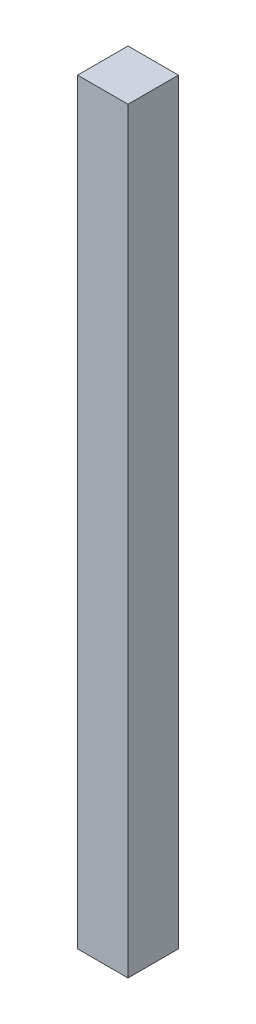
ISO-10303-21;
HEADER;
FILE_DESCRIPTION(('STEP AP214'),'2;1');
FILE_NAME('part.step','',(''),(''),'','','');
FILE_SCHEMA(('AUTOMOTIVE_DESIGN { 1 0 10303 214 1 1 1 1 }'));
ENDSEC;
DATA;
#1=APPLICATION_CONTEXT('core data for automotive mechanical design processes');
#2=APPLICATION_PROTOCOL_DEFINITION('international standard','automotive_design',2000,#1);
#3=PRODUCT_CONTEXT('',#1,'mechanical');
#4=PRODUCT('Part','Part','',(#3));
#5=PRODUCT_RELATED_PRODUCT_CATEGORY('part','',(#4));
#6=PRODUCT_DEFINITION_FORMATION('','',#4);
#7=PRODUCT_DEFINITION_CONTEXT('part definition',#1,'design');
#8=PRODUCT_DEFINITION('design','',#6,#7);
#9=PRODUCT_DEFINITION_SHAPE('','',#8);
#10=(LENGTH_UNIT() NAMED_UNIT(*) SI_UNIT(.MILLI.,.METRE.));
#11=(NAMED_UNIT(*) PLANE_ANGLE_UNIT() SI_UNIT($,.RADIAN.));
#12=(NAMED_UNIT(*) SI_UNIT($,.STERADIAN.) SOLID_ANGLE_UNIT());
#13=UNCERTAINTY_MEASURE_WITH_UNIT(LENGTH_MEASURE(1.E-05),#10,'distance_accuracy_value','');
#14=(GEOMETRIC_REPRESENTATION_CONTEXT(3) GLOBAL_UNCERTAINTY_ASSIGNED_CONTEXT((#13)) GLOBAL_UNIT_ASSIGNED_CONTEXT((#10,
#11,#12)) REPRESENTATION_CONTEXT('',''));
#15=CARTESIAN_POINT('',(0.,0.,0.));
#16=DIRECTION('',(0.,0.,1.));
#17=DIRECTION('',(1.,0.,0.));
#18=AXIS2_PLACEMENT_3D('',#15,#16,#17);
#19=CARTESIAN_POINT('',(0.5,15.,0.500000000000004));
#20=DIRECTION('',(-1.,0.,0.));
#21=DIRECTION('',(0.,0.,1.));
#22=AXIS2_PLACEMENT_3D('',#19,#20,#21);
#23=PLANE('',#22);
#24=DIRECTION('',(0.,0.,-1.));
#25=VECTOR('',#24,1.);
#26=CARTESIAN_POINT('',(0.5,0.,0.500000000000004));
#27=LINE('',#26,#25);
#28=CARTESIAN_POINT('',(0.5,0.,0.500000000000004));
#29=VERTEX_POINT('',#28);
#30=CARTESIAN_POINT('',(0.5,0.,-0.499999999999997));
#31=VERTEX_POINT('',#30);
#32=EDGE_CURVE('E107',#29,#31,#27,.T.);
#33=ORIENTED_EDGE('',*,*,#32,.T.);
#34=DIRECTION('',(0.,-1.,0.));
#35=VECTOR('',#34,1.);
#36=CARTESIAN_POINT('',(0.5,15.,-0.499999999999997));
#37=LINE('',#36,#35);
#38=CARTESIAN_POINT('',(0.5,15.,-0.499999999999997));
#39=VERTEX_POINT('',#38);
#40=EDGE_CURVE('E11',#39,#31,#37,.T.);
#41=ORIENTED_EDGE('',*,*,#40,.F.);
#42=DIRECTION('',(0.,0.,-1.));
#43=VECTOR('',#42,1.);
#44=CARTESIAN_POINT('',(0.5,15.,0.500000000000004));
#45=LINE('',#44,#43);
#46=CARTESIAN_POINT('',(0.5,15.,0.500000000000004));
#47=VERTEX_POINT('',#46);
#48=EDGE_CURVE('E91',#47,#39,#45,.T.);
#49=ORIENTED_EDGE('',*,*,#48,.F.);
#50=DIRECTION('',(0.,-1.,0.));
#51=VECTOR('',#50,1.);
#52=CARTESIAN_POINT('',(0.5,15.,0.500000000000004));
#53=LINE('',#52,#51);
#54=EDGE_CURVE('E103',#47,#29,#53,.T.);
#55=ORIENTED_EDGE('',*,*,#54,.T.);
#56=EDGE_LOOP('',(#33,#41,#49,#55));
#57=FACE_BOUND('',#56,.T.);
#58=ADVANCED_FACE('F39',(#57),#23,.F.);
#59=CARTESIAN_POINT('',(-0.5,15.,-0.499999999999997));
#60=DIRECTION('',(0.,0.,1.));
#61=DIRECTION('',(1.,0.,0.));
#62=AXIS2_PLACEMENT_3D('',#59,#60,#61);
#63=PLANE('',#62);
#64=DIRECTION('',(-1.,0.,0.));
#65=VECTOR('',#64,1.);
#66=CARTESIAN_POINT('',(-0.5,0.,-0.499999999999997));
#67=LINE('',#66,#65);
#68=CARTESIAN_POINT('',(-0.5,0.,-0.499999999999997));
#69=VERTEX_POINT('',#68);
#70=EDGE_CURVE('E96',#31,#69,#67,.T.);
#71=ORIENTED_EDGE('',*,*,#70,.T.);
#72=DIRECTION('',(0.,-1.,0.));
#73=VECTOR('',#72,1.);
#74=CARTESIAN_POINT('',(-0.5,15.,-0.499999999999997));
#75=LINE('',#74,#73);
#76=CARTESIAN_POINT('',(-0.5,15.,-0.499999999999997));
#77=VERTEX_POINT('',#76);
#78=EDGE_CURVE('E48',#77,#69,#75,.T.);
#79=ORIENTED_EDGE('',*,*,#78,.F.);
#80=DIRECTION('',(-1.,0.,0.));
#81=VECTOR('',#80,1.);
#82=CARTESIAN_POINT('',(-0.5,15.,-0.499999999999997));
#83=LINE('',#82,#81);
#84=EDGE_CURVE('E86',#39,#77,#83,.T.);
#85=ORIENTED_EDGE('',*,*,#84,.F.);
#86=ORIENTED_EDGE('',*,*,#40,.T.);
#87=EDGE_LOOP('',(#71,#79,#85,#86));
#88=FACE_BOUND('',#87,.T.);
#89=ADVANCED_FACE('F95',(#88),#63,.F.);
#90=CARTESIAN_POINT('',(-0.5,15.,0.500000000000004));
#91=DIRECTION('',(1.,0.,0.));
#92=DIRECTION('',(0.,0.,-1.));
#93=AXIS2_PLACEMENT_3D('',#90,#91,#92);
#94=PLANE('',#93);
#95=DIRECTION('',(0.,0.,1.));
#96=VECTOR('',#95,1.);
#97=CARTESIAN_POINT('',(-0.5,0.,0.500000000000004));
#98=LINE('',#97,#96);
#99=CARTESIAN_POINT('',(-0.5,0.,0.500000000000004));
#100=VERTEX_POINT('',#99);
#101=EDGE_CURVE('E73',#69,#100,#98,.T.);
#102=ORIENTED_EDGE('',*,*,#101,.T.);
#103=DIRECTION('',(0.,-1.,0.));
#104=VECTOR('',#103,1.);
#105=CARTESIAN_POINT('',(-0.5,15.,0.500000000000004));
#106=LINE('',#105,#104);
#107=CARTESIAN_POINT('',(-0.5,15.,0.500000000000004));
#108=VERTEX_POINT('',#107);
#109=EDGE_CURVE('E98',#108,#100,#106,.T.);
#110=ORIENTED_EDGE('',*,*,#109,.F.);
#111=DIRECTION('',(0.,0.,1.));
#112=VECTOR('',#111,1.);
#113=CARTESIAN_POINT('',(-0.5,15.,0.500000000000004));
#114=LINE('',#113,#112);
#115=EDGE_CURVE('E89',#77,#108,#114,.T.);
#116=ORIENTED_EDGE('',*,*,#115,.F.);
#117=ORIENTED_EDGE('',*,*,#78,.T.);
#118=EDGE_LOOP('',(#102,#110,#116,#117));
#119=FACE_BOUND('',#118,.T.);
#120=ADVANCED_FACE('F99',(#119),#94,.F.);
#121=CARTESIAN_POINT('',(-0.5,15.,0.500000000000004));
#122=DIRECTION('',(0.,0.,-1.));
#123=DIRECTION('',(-1.,0.,0.));
#124=AXIS2_PLACEMENT_3D('',#121,#122,#123);
#125=PLANE('',#124);
#126=DIRECTION('',(1.,0.,0.));
#127=VECTOR('',#126,1.);
#128=CARTESIAN_POINT('',(-0.5,0.,0.500000000000004));
#129=LINE('',#128,#127);
#130=EDGE_CURVE('E79',#100,#29,#129,.T.);
#131=ORIENTED_EDGE('',*,*,#130,.T.);
#132=ORIENTED_EDGE('',*,*,#54,.F.);
#133=DIRECTION('',(1.,0.,0.));
#134=VECTOR('',#133,1.);
#135=CARTESIAN_POINT('',(-0.5,15.,0.500000000000004));
#136=LINE('',#135,#134);
#137=EDGE_CURVE('E56',#108,#47,#136,.T.);
#138=ORIENTED_EDGE('',*,*,#137,.F.);
#139=ORIENTED_EDGE('',*,*,#109,.T.);
#140=EDGE_LOOP('',(#131,#132,#138,#139));
#141=FACE_BOUND('',#140,.T.);
#142=ADVANCED_FACE('F120',(#141),#125,.F.);
#143=CARTESIAN_POINT('',(0.,15.,0.));
#144=DIRECTION('',(0.,-1.,0.));
#145=DIRECTION('',(0.,0.,-1.));
#146=AXIS2_PLACEMENT_3D('',#143,#144,#145);
#147=PLANE('',#146);
#148=ORIENTED_EDGE('',*,*,#48,.T.);
#149=ORIENTED_EDGE('',*,*,#84,.T.);
#150=ORIENTED_EDGE('',*,*,#115,.T.);
#151=ORIENTED_EDGE('',*,*,#137,.T.);
#152=EDGE_LOOP('',(#148,#149,#150,#151));
#153=FACE_BOUND('',#152,.T.);
#154=ADVANCED_FACE('F87',(#153),#147,.F.);
#155=CARTESIAN_POINT('',(0.,0.,0.));
#156=DIRECTION('',(0.,-1.,0.));
#157=DIRECTION('',(0.,0.,-1.));
#158=AXIS2_PLACEMENT_3D('',#155,#156,#157);
#159=PLANE('',#158);
#160=ORIENTED_EDGE('',*,*,#32,.F.);
#161=ORIENTED_EDGE('',*,*,#130,.F.);
#162=ORIENTED_EDGE('',*,*,#101,.F.);
#163=ORIENTED_EDGE('',*,*,#70,.F.);
#164=EDGE_LOOP('',(#160,#161,#162,#163));
#165=FACE_BOUND('',#164,.T.);
#166=ADVANCED_FACE('F123',(#165),#159,.T.);
#167=CLOSED_SHELL('',(#58,#89,#120,#142,#154,#166));
#168=MANIFOLD_SOLID_BREP('B2',#167);
#169=ADVANCED_BREP_SHAPE_REPRESENTATION('',(#18,#168),#14);
#170=SHAPE_DEFINITION_REPRESENTATION(#9,#169);
ENDSEC;
END-ISO-10303-21;
